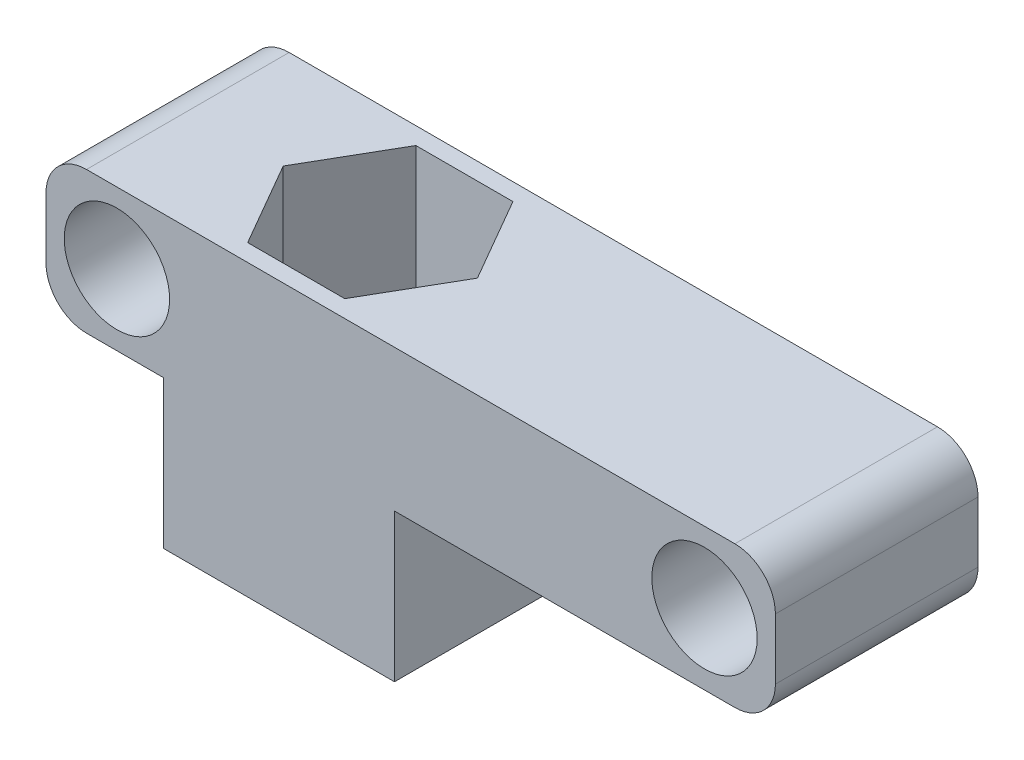
ISO-10303-21;
HEADER;
FILE_DESCRIPTION(('STEP AP214'),'2;1');
FILE_NAME('part.step','',(''),(''),'','','');
FILE_SCHEMA(('AUTOMOTIVE_DESIGN { 1 0 10303 214 1 1 1 1 }'));
ENDSEC;
DATA;
#1=APPLICATION_CONTEXT('core data for automotive mechanical design processes');
#2=APPLICATION_PROTOCOL_DEFINITION('international standard','automotive_design',2000,#1);
#3=PRODUCT_CONTEXT('',#1,'mechanical');
#4=PRODUCT('Part','Part','',(#3));
#5=PRODUCT_RELATED_PRODUCT_CATEGORY('part','',(#4));
#6=PRODUCT_DEFINITION_FORMATION('','',#4);
#7=PRODUCT_DEFINITION_CONTEXT('part definition',#1,'design');
#8=PRODUCT_DEFINITION('design','',#6,#7);
#9=PRODUCT_DEFINITION_SHAPE('','',#8);
#10=(LENGTH_UNIT() NAMED_UNIT(*) SI_UNIT(.MILLI.,.METRE.));
#11=(NAMED_UNIT(*) PLANE_ANGLE_UNIT() SI_UNIT($,.RADIAN.));
#12=(NAMED_UNIT(*) SI_UNIT($,.STERADIAN.) SOLID_ANGLE_UNIT());
#13=UNCERTAINTY_MEASURE_WITH_UNIT(LENGTH_MEASURE(1.E-05),#10,'distance_accuracy_value','');
#14=(GEOMETRIC_REPRESENTATION_CONTEXT(3) GLOBAL_UNCERTAINTY_ASSIGNED_CONTEXT((#13)) GLOBAL_UNIT_ASSIGNED_CONTEXT((#10,
#11,#12)) REPRESENTATION_CONTEXT('',''));
#15=CARTESIAN_POINT('',(0.,0.,0.));
#16=DIRECTION('',(0.,0.,1.));
#17=DIRECTION('',(1.,0.,0.));
#18=AXIS2_PLACEMENT_3D('',#15,#16,#17);
#19=CARTESIAN_POINT('',(-46.016694490818,8.8780487804878,10.));
#20=DIRECTION('',(0.,1.,0.));
#21=DIRECTION('',(0.,0.,1.));
#22=AXIS2_PLACEMENT_3D('',#19,#20,#21);
#23=PLANE('',#22);
#24=DIRECTION('',(1.,0.,0.));
#25=VECTOR('',#24,1.);
#26=CARTESIAN_POINT('',(-46.016694490818,8.8780487804878,10.));
#27=LINE('',#26,#25);
#28=CARTESIAN_POINT('',(-44.016694490818,8.8780487804878,10.));
#29=VERTEX_POINT('',#28);
#30=CARTESIAN_POINT('',(-40.216694490818,8.8780487804878,10.));
#31=VERTEX_POINT('',#30);
#32=EDGE_CURVE('E325',#29,#31,#27,.T.);
#33=ORIENTED_EDGE('',*,*,#32,.F.);
#34=DIRECTION('',(0.,0.,-1.));
#35=VECTOR('',#34,1.);
#36=CARTESIAN_POINT('',(-44.016694490818,8.8780487804878,10.));
#37=LINE('',#36,#35);
#38=CARTESIAN_POINT('',(-44.016694490818,8.8780487804878,0.));
#39=VERTEX_POINT('',#38);
#40=EDGE_CURVE('E347',#29,#39,#37,.T.);
#41=ORIENTED_EDGE('',*,*,#40,.T.);
#42=DIRECTION('',(1.,0.,0.));
#43=VECTOR('',#42,1.);
#44=CARTESIAN_POINT('',(-46.016694490818,8.8780487804878,0.));
#45=LINE('',#44,#43);
#46=CARTESIAN_POINT('',(-40.216694490818,8.8780487804878,0.));
#47=VERTEX_POINT('',#46);
#48=EDGE_CURVE('E306',#39,#47,#45,.T.);
#49=ORIENTED_EDGE('',*,*,#48,.T.);
#50=DIRECTION('',(0.,0.,-1.));
#51=VECTOR('',#50,1.);
#52=CARTESIAN_POINT('',(-40.216694490818,8.8780487804878,10.));
#53=LINE('',#52,#51);
#54=EDGE_CURVE('E203',#31,#47,#53,.T.);
#55=ORIENTED_EDGE('',*,*,#54,.F.);
#56=EDGE_LOOP('',(#33,#41,#49,#55));
#57=FACE_BOUND('',#56,.T.);
#58=ADVANCED_FACE('F33',(#57),#23,.F.);
#59=CARTESIAN_POINT('',(-28.816694490818,8.8780487804878,0.));
#60=VERTEX_POINT('',#59);
#61=CARTESIAN_POINT('',(-12.016694490818,8.8780487804878,0.));
#62=VERTEX_POINT('',#61);
#63=EDGE_CURVE('E310',#60,#62,#45,.T.);
#64=ORIENTED_EDGE('',*,*,#63,.T.);
#65=DIRECTION('',(0.,0.,-1.));
#66=VECTOR('',#65,1.);
#67=CARTESIAN_POINT('',(-12.016694490818,8.8780487804878,10.));
#68=LINE('',#67,#66);
#69=CARTESIAN_POINT('',(-12.016694490818,8.8780487804878,10.));
#70=VERTEX_POINT('',#69);
#71=EDGE_CURVE('E48',#62,#70,#68,.F.);
#72=ORIENTED_EDGE('',*,*,#71,.T.);
#73=CARTESIAN_POINT('',(-28.816694490818,8.8780487804878,10.));
#74=VERTEX_POINT('',#73);
#75=EDGE_CURVE('E322',#74,#70,#27,.T.);
#76=ORIENTED_EDGE('',*,*,#75,.F.);
#77=DIRECTION('',(0.,0.,1.));
#78=VECTOR('',#77,1.);
#79=CARTESIAN_POINT('',(-28.816694490818,8.8780487804878,10.));
#80=LINE('',#79,#78);
#81=EDGE_CURVE('E292',#60,#74,#80,.T.);
#82=ORIENTED_EDGE('',*,*,#81,.F.);
#83=EDGE_LOOP('',(#64,#72,#76,#82));
#84=FACE_BOUND('',#83,.T.);
#85=ADVANCED_FACE('F487',(#84),#23,.F.);
#86=CARTESIAN_POINT('',(0.,0.,10.));
#87=DIRECTION('',(0.,0.,1.));
#88=DIRECTION('',(1.,0.,0.));
#89=AXIS2_PLACEMENT_3D('',#86,#87,#88);
#90=PLANE('',#89);
#91=CARTESIAN_POINT('',(-42.516694490818,12.3780487804878,10.));
#92=DIRECTION('',(0.,0.,1.));
#93=DIRECTION('',(1.,0.,0.));
#94=AXIS2_PLACEMENT_3D('',#91,#92,#93);
#95=CIRCLE('',#94,2.6);
#96=CARTESIAN_POINT('',(-39.916694490818,12.3780487804878,10.));
#97=VERTEX_POINT('',#96);
#98=EDGE_CURVE('E361',#97,#97,#95,.T.);
#99=ORIENTED_EDGE('',*,*,#98,.F.);
#100=EDGE_LOOP('',(#99));
#101=FACE_BOUND('',#100,.T.);
#102=DIRECTION('',(0.,1.,0.));
#103=VECTOR('',#102,1.);
#104=CARTESIAN_POINT('',(-10.016694490818,15.8780487804878,10.));
#105=LINE('',#104,#103);
#106=CARTESIAN_POINT('',(-10.016694490818,10.8780487804878,10.));
#107=VERTEX_POINT('',#106);
#108=CARTESIAN_POINT('',(-10.016694490818,13.8780487804878,10.));
#109=VERTEX_POINT('',#108);
#110=EDGE_CURVE('E332',#107,#109,#105,.T.);
#111=ORIENTED_EDGE('',*,*,#110,.T.);
#112=CARTESIAN_POINT('',(-12.016694490818,13.8780487804878,10.));
#113=DIRECTION('',(0.,0.,1.));
#114=DIRECTION('',(1.,0.,0.));
#115=AXIS2_PLACEMENT_3D('',#112,#113,#114);
#116=CIRCLE('',#115,2.);
#117=CARTESIAN_POINT('',(-12.016694490818,15.8780487804878,10.));
#118=VERTEX_POINT('',#117);
#119=EDGE_CURVE('E344',#109,#118,#116,.T.);
#120=ORIENTED_EDGE('',*,*,#119,.T.);
#121=DIRECTION('',(-1.,0.,0.));
#122=VECTOR('',#121,1.);
#123=CARTESIAN_POINT('',(-46.016694490818,15.8780487804878,10.));
#124=LINE('',#123,#122);
#125=CARTESIAN_POINT('',(-44.016694490818,15.8780487804878,10.));
#126=VERTEX_POINT('',#125);
#127=EDGE_CURVE('E302',#118,#126,#124,.T.);
#128=ORIENTED_EDGE('',*,*,#127,.T.);
#129=CARTESIAN_POINT('',(-44.016694490818,13.8780487804878,10.));
#130=DIRECTION('',(0.,0.,1.));
#131=DIRECTION('',(1.,0.,0.));
#132=AXIS2_PLACEMENT_3D('',#129,#130,#131);
#133=CIRCLE('',#132,2.);
#134=CARTESIAN_POINT('',(-46.016694490818,13.8780487804878,10.));
#135=VERTEX_POINT('',#134);
#136=EDGE_CURVE('E339',#126,#135,#133,.T.);
#137=ORIENTED_EDGE('',*,*,#136,.T.);
#138=DIRECTION('',(0.,-1.,0.));
#139=VECTOR('',#138,1.);
#140=CARTESIAN_POINT('',(-46.016694490818,15.8780487804878,10.));
#141=LINE('',#140,#139);
#142=CARTESIAN_POINT('',(-46.016694490818,10.8780487804878,10.));
#143=VERTEX_POINT('',#142);
#144=EDGE_CURVE('E326',#135,#143,#141,.T.);
#145=ORIENTED_EDGE('',*,*,#144,.T.);
#146=CARTESIAN_POINT('',(-44.016694490818,10.8780487804878,10.));
#147=DIRECTION('',(0.,0.,1.));
#148=DIRECTION('',(1.,0.,0.));
#149=AXIS2_PLACEMENT_3D('',#146,#147,#148);
#150=CIRCLE('',#149,2.);
#151=EDGE_CURVE('E56',#143,#29,#150,.T.);
#152=ORIENTED_EDGE('',*,*,#151,.T.);
#153=ORIENTED_EDGE('',*,*,#32,.T.);
#154=DIRECTION('',(0.,1.,0.));
#155=VECTOR('',#154,1.);
#156=CARTESIAN_POINT('',(-40.216694490818,3.8780487804878,10.));
#157=LINE('',#156,#155);
#158=CARTESIAN_POINT('',(-40.216694490818,1.5780487804878,10.));
#159=VERTEX_POINT('',#158);
#160=EDGE_CURVE('E294',#159,#31,#157,.T.);
#161=ORIENTED_EDGE('',*,*,#160,.F.);
#162=DIRECTION('',(-1.,0.,0.));
#163=VECTOR('',#162,1.);
#164=CARTESIAN_POINT('',(-40.216694490818,1.5780487804878,10.));
#165=LINE('',#164,#163);
#166=CARTESIAN_POINT('',(-28.816694490818,1.5780487804878,10.));
#167=VERTEX_POINT('',#166);
#168=EDGE_CURVE('E225',#167,#159,#165,.T.);
#169=ORIENTED_EDGE('',*,*,#168,.F.);
#170=DIRECTION('',(0.,1.,0.));
#171=VECTOR('',#170,1.);
#172=CARTESIAN_POINT('',(-28.816694490818,3.8780487804878,10.));
#173=LINE('',#172,#171);
#174=EDGE_CURVE('E296',#167,#74,#173,.T.);
#175=ORIENTED_EDGE('',*,*,#174,.T.);
#176=ORIENTED_EDGE('',*,*,#75,.T.);
#177=CARTESIAN_POINT('',(-12.016694490818,10.8780487804878,10.));
#178=DIRECTION('',(0.,0.,1.));
#179=DIRECTION('',(1.,0.,0.));
#180=AXIS2_PLACEMENT_3D('',#177,#178,#179);
#181=CIRCLE('',#180,2.);
#182=EDGE_CURVE('E342',#70,#107,#181,.T.);
#183=ORIENTED_EDGE('',*,*,#182,.T.);
#184=EDGE_LOOP('',(#111,#120,#128,#137,#145,#152,#153,#161,#169,#175,#176,#183));
#185=FACE_BOUND('',#184,.T.);
#186=CARTESIAN_POINT('',(-13.516694490818,12.3780487804878,10.));
#187=DIRECTION('',(0.,0.,1.));
#188=DIRECTION('',(1.,0.,0.));
#189=AXIS2_PLACEMENT_3D('',#186,#187,#188);
#190=CIRCLE('',#189,2.6);
#191=CARTESIAN_POINT('',(-10.916694490818,12.3780487804878,10.));
#192=VERTEX_POINT('',#191);
#193=EDGE_CURVE('E368',#192,#192,#190,.T.);
#194=ORIENTED_EDGE('',*,*,#193,.F.);
#195=EDGE_LOOP('',(#194));
#196=FACE_BOUND('',#195,.T.);
#197=ADVANCED_FACE('F493',(#101,#185,#196),#90,.T.);
#198=CARTESIAN_POINT('',(0.,0.,0.));
#199=DIRECTION('',(0.,0.,1.));
#200=DIRECTION('',(1.,0.,0.));
#201=AXIS2_PLACEMENT_3D('',#198,#199,#200);
#202=PLANE('',#201);
#203=DIRECTION('',(-1.,0.,0.));
#204=VECTOR('',#203,1.);
#205=CARTESIAN_POINT('',(-46.016694490818,15.8780487804878,0.));
#206=LINE('',#205,#204);
#207=CARTESIAN_POINT('',(-12.016694490818,15.8780487804878,0.));
#208=VERTEX_POINT('',#207);
#209=CARTESIAN_POINT('',(-44.016694490818,15.8780487804878,0.));
#210=VERTEX_POINT('',#209);
#211=EDGE_CURVE('E321',#208,#210,#206,.T.);
#212=ORIENTED_EDGE('',*,*,#211,.F.);
#213=CARTESIAN_POINT('',(-12.016694490818,13.8780487804878,0.));
#214=DIRECTION('',(0.,0.,1.));
#215=DIRECTION('',(1.,0.,0.));
#216=AXIS2_PLACEMENT_3D('',#213,#214,#215);
#217=CIRCLE('',#216,2.);
#218=CARTESIAN_POINT('',(-10.016694490818,13.8780487804878,0.));
#219=VERTEX_POINT('',#218);
#220=EDGE_CURVE('E530',#208,#219,#217,.F.);
#221=ORIENTED_EDGE('',*,*,#220,.T.);
#222=DIRECTION('',(0.,1.,0.));
#223=VECTOR('',#222,1.);
#224=CARTESIAN_POINT('',(-10.016694490818,15.8780487804878,0.));
#225=LINE('',#224,#223);
#226=CARTESIAN_POINT('',(-10.016694490818,10.8780487804878,0.));
#227=VERTEX_POINT('',#226);
#228=EDGE_CURVE('E309',#227,#219,#225,.T.);
#229=ORIENTED_EDGE('',*,*,#228,.F.);
#230=CARTESIAN_POINT('',(-12.016694490818,10.8780487804878,0.));
#231=DIRECTION('',(0.,0.,1.));
#232=DIRECTION('',(1.,0.,0.));
#233=AXIS2_PLACEMENT_3D('',#230,#231,#232);
#234=CIRCLE('',#233,2.);
#235=EDGE_CURVE('E526',#227,#62,#234,.F.);
#236=ORIENTED_EDGE('',*,*,#235,.T.);
#237=ORIENTED_EDGE('',*,*,#63,.F.);
#238=DIRECTION('',(0.,1.,0.));
#239=VECTOR('',#238,1.);
#240=CARTESIAN_POINT('',(-28.816694490818,3.8780487804878,0.));
#241=LINE('',#240,#239);
#242=CARTESIAN_POINT('',(-28.816694490818,1.5780487804878,0.));
#243=VERTEX_POINT('',#242);
#244=EDGE_CURVE('E207',#243,#60,#241,.T.);
#245=ORIENTED_EDGE('',*,*,#244,.F.);
#246=DIRECTION('',(1.,0.,0.));
#247=VECTOR('',#246,1.);
#248=CARTESIAN_POINT('',(-40.216694490818,1.5780487804878,0.));
#249=LINE('',#248,#247);
#250=CARTESIAN_POINT('',(-40.216694490818,1.5780487804878,0.));
#251=VERTEX_POINT('',#250);
#252=EDGE_CURVE('E210',#251,#243,#249,.T.);
#253=ORIENTED_EDGE('',*,*,#252,.F.);
#254=DIRECTION('',(0.,1.,0.));
#255=VECTOR('',#254,1.);
#256=CARTESIAN_POINT('',(-40.216694490818,3.8780487804878,0.));
#257=LINE('',#256,#255);
#258=EDGE_CURVE('E196',#251,#47,#257,.T.);
#259=ORIENTED_EDGE('',*,*,#258,.T.);
#260=ORIENTED_EDGE('',*,*,#48,.F.);
#261=CARTESIAN_POINT('',(-44.016694490818,10.8780487804878,0.));
#262=DIRECTION('',(0.,0.,1.));
#263=DIRECTION('',(1.,0.,0.));
#264=AXIS2_PLACEMENT_3D('',#261,#262,#263);
#265=CIRCLE('',#264,2.);
#266=CARTESIAN_POINT('',(-46.016694490818,10.8780487804878,0.));
#267=VERTEX_POINT('',#266);
#268=EDGE_CURVE('E360',#39,#267,#265,.F.);
#269=ORIENTED_EDGE('',*,*,#268,.T.);
#270=DIRECTION('',(0.,-1.,0.));
#271=VECTOR('',#270,1.);
#272=CARTESIAN_POINT('',(-46.016694490818,15.8780487804878,0.));
#273=LINE('',#272,#271);
#274=CARTESIAN_POINT('',(-46.016694490818,13.8780487804878,0.));
#275=VERTEX_POINT('',#274);
#276=EDGE_CURVE('E315',#275,#267,#273,.T.);
#277=ORIENTED_EDGE('',*,*,#276,.F.);
#278=CARTESIAN_POINT('',(-44.016694490818,13.8780487804878,0.));
#279=DIRECTION('',(0.,0.,1.));
#280=DIRECTION('',(1.,0.,0.));
#281=AXIS2_PLACEMENT_3D('',#278,#279,#280);
#282=CIRCLE('',#281,2.);
#283=EDGE_CURVE('E305',#275,#210,#282,.F.);
#284=ORIENTED_EDGE('',*,*,#283,.T.);
#285=EDGE_LOOP('',(#212,#221,#229,#236,#237,#245,#253,#259,#260,#269,#277,#284));
#286=FACE_BOUND('',#285,.T.);
#287=CARTESIAN_POINT('',(-42.516694490818,12.3780487804878,0.));
#288=DIRECTION('',(0.,0.,1.));
#289=DIRECTION('',(1.,0.,0.));
#290=AXIS2_PLACEMENT_3D('',#287,#288,#289);
#291=CIRCLE('',#290,2.6);
#292=CARTESIAN_POINT('',(-39.916694490818,12.3780487804878,0.));
#293=VERTEX_POINT('',#292);
#294=EDGE_CURVE('E363',#293,#293,#291,.T.);
#295=ORIENTED_EDGE('',*,*,#294,.T.);
#296=EDGE_LOOP('',(#295));
#297=FACE_BOUND('',#296,.T.);
#298=CARTESIAN_POINT('',(-13.516694490818,12.3780487804878,0.));
#299=DIRECTION('',(0.,0.,1.));
#300=DIRECTION('',(1.,0.,0.));
#301=AXIS2_PLACEMENT_3D('',#298,#299,#300);
#302=CIRCLE('',#301,2.6);
#303=CARTESIAN_POINT('',(-10.916694490818,12.3780487804878,0.));
#304=VERTEX_POINT('',#303);
#305=EDGE_CURVE('E370',#304,#304,#302,.T.);
#306=ORIENTED_EDGE('',*,*,#305,.T.);
#307=EDGE_LOOP('',(#306));
#308=FACE_BOUND('',#307,.T.);
#309=ADVANCED_FACE('F212',(#286,#297,#308),#202,.F.);
#310=CARTESIAN_POINT('',(-46.016694490818,15.8780487804878,10.));
#311=DIRECTION('',(1.,0.,0.));
#312=DIRECTION('',(0.,0.,-1.));
#313=AXIS2_PLACEMENT_3D('',#310,#311,#312);
#314=PLANE('',#313);
#315=ORIENTED_EDGE('',*,*,#276,.T.);
#316=DIRECTION('',(0.,0.,-1.));
#317=VECTOR('',#316,1.);
#318=CARTESIAN_POINT('',(-46.016694490818,10.8780487804878,10.));
#319=LINE('',#318,#317);
#320=EDGE_CURVE('E11',#267,#143,#319,.F.);
#321=ORIENTED_EDGE('',*,*,#320,.T.);
#322=ORIENTED_EDGE('',*,*,#144,.F.);
#323=DIRECTION('',(0.,0.,-1.));
#324=VECTOR('',#323,1.);
#325=CARTESIAN_POINT('',(-46.016694490818,13.8780487804878,10.));
#326=LINE('',#325,#324);
#327=EDGE_CURVE('E41',#135,#275,#326,.T.);
#328=ORIENTED_EDGE('',*,*,#327,.T.);
#329=EDGE_LOOP('',(#315,#321,#322,#328));
#330=FACE_BOUND('',#329,.T.);
#331=ADVANCED_FACE('F355',(#330),#314,.F.);
#332=CARTESIAN_POINT('',(-10.016694490818,15.8780487804878,10.));
#333=DIRECTION('',(-1.,0.,0.));
#334=DIRECTION('',(0.,-1.,0.));
#335=AXIS2_PLACEMENT_3D('',#332,#333,#334);
#336=PLANE('',#335);
#337=ORIENTED_EDGE('',*,*,#228,.T.);
#338=DIRECTION('',(0.,0.,-1.));
#339=VECTOR('',#338,1.);
#340=CARTESIAN_POINT('',(-10.016694490818,13.8780487804878,10.));
#341=LINE('',#340,#339);
#342=EDGE_CURVE('E337',#219,#109,#341,.F.);
#343=ORIENTED_EDGE('',*,*,#342,.T.);
#344=ORIENTED_EDGE('',*,*,#110,.F.);
#345=DIRECTION('',(0.,0.,-1.));
#346=VECTOR('',#345,1.);
#347=CARTESIAN_POINT('',(-10.016694490818,10.8780487804878,10.));
#348=LINE('',#347,#346);
#349=EDGE_CURVE('E532',#107,#227,#348,.T.);
#350=ORIENTED_EDGE('',*,*,#349,.T.);
#351=EDGE_LOOP('',(#337,#343,#344,#350));
#352=FACE_BOUND('',#351,.T.);
#353=ADVANCED_FACE('F496',(#352),#336,.F.);
#354=CARTESIAN_POINT('',(-46.016694490818,15.8780487804878,10.));
#355=DIRECTION('',(0.,-1.,0.));
#356=DIRECTION('',(0.,0.,-1.));
#357=AXIS2_PLACEMENT_3D('',#354,#355,#356);
#358=PLANE('',#357);
#359=DIRECTION('',(1.,0.,0.));
#360=VECTOR('',#359,1.);
#361=CARTESIAN_POINT('',(-36.912698107955,15.8780487804878,0.849999999999997));
#362=LINE('',#361,#360);
#363=CARTESIAN_POINT('',(-36.912698107955,15.8780487804878,0.849999999999997));
#364=VERTEX_POINT('',#363);
#365=CARTESIAN_POINT('',(-32.1206908736811,15.8780487804878,0.849999999999996));
#366=VERTEX_POINT('',#365);
#367=EDGE_CURVE('E380',#364,#366,#362,.T.);
#368=ORIENTED_EDGE('',*,*,#367,.T.);
#369=DIRECTION('',(0.5,0.,0.866025403784439));
#370=VECTOR('',#369,1.);
#371=CARTESIAN_POINT('',(-32.1206908736811,15.8780487804878,0.849999999999996));
#372=LINE('',#371,#370);
#373=CARTESIAN_POINT('',(-29.7246872565441,15.8780487804878,5.00000000000001));
#374=VERTEX_POINT('',#373);
#375=EDGE_CURVE('E397',#366,#374,#372,.T.);
#376=ORIENTED_EDGE('',*,*,#375,.T.);
#377=DIRECTION('',(-0.5,0.,0.866025403784439));
#378=VECTOR('',#377,1.);
#379=CARTESIAN_POINT('',(-29.7246872565441,15.8780487804878,5.00000000000001));
#380=LINE('',#379,#378);
#381=CARTESIAN_POINT('',(-32.1206908736811,15.8780487804878,9.15));
#382=VERTEX_POINT('',#381);
#383=EDGE_CURVE('E423',#374,#382,#380,.T.);
#384=ORIENTED_EDGE('',*,*,#383,.T.);
#385=DIRECTION('',(-1.,0.,0.));
#386=VECTOR('',#385,1.);
#387=CARTESIAN_POINT('',(-32.1206908736811,15.8780487804878,9.15));
#388=LINE('',#387,#386);
#389=CARTESIAN_POINT('',(-36.912698107955,15.8780487804878,9.15));
#390=VERTEX_POINT('',#389);
#391=EDGE_CURVE('E420',#382,#390,#388,.T.);
#392=ORIENTED_EDGE('',*,*,#391,.T.);
#393=DIRECTION('',(-0.5,0.,-0.866025403784439));
#394=VECTOR('',#393,1.);
#395=CARTESIAN_POINT('',(-36.912698107955,15.8780487804878,9.15));
#396=LINE('',#395,#394);
#397=CARTESIAN_POINT('',(-39.3087017250919,15.8780487804878,4.99999999999999));
#398=VERTEX_POINT('',#397);
#399=EDGE_CURVE('E417',#390,#398,#396,.T.);
#400=ORIENTED_EDGE('',*,*,#399,.T.);
#401=DIRECTION('',(0.5,0.,-0.866025403784438));
#402=VECTOR('',#401,1.);
#403=CARTESIAN_POINT('',(-39.3087017250919,15.8780487804878,4.99999999999999));
#404=LINE('',#403,#402);
#405=EDGE_CURVE('E414',#398,#364,#404,.T.);
#406=ORIENTED_EDGE('',*,*,#405,.T.);
#407=EDGE_LOOP('',(#368,#376,#384,#392,#400,#406));
#408=FACE_BOUND('',#407,.T.);
#409=ORIENTED_EDGE('',*,*,#127,.F.);
#410=DIRECTION('',(0.,0.,-1.));
#411=VECTOR('',#410,1.);
#412=CARTESIAN_POINT('',(-12.016694490818,15.8780487804878,10.));
#413=LINE('',#412,#411);
#414=EDGE_CURVE('E301',#118,#208,#413,.T.);
#415=ORIENTED_EDGE('',*,*,#414,.T.);
#416=ORIENTED_EDGE('',*,*,#211,.T.);
#417=DIRECTION('',(0.,0.,-1.));
#418=VECTOR('',#417,1.);
#419=CARTESIAN_POINT('',(-44.016694490818,15.8780487804878,10.));
#420=LINE('',#419,#418);
#421=EDGE_CURVE('E299',#210,#126,#420,.F.);
#422=ORIENTED_EDGE('',*,*,#421,.T.);
#423=EDGE_LOOP('',(#409,#415,#416,#422));
#424=FACE_BOUND('',#423,.T.);
#425=ADVANCED_FACE('F428',(#408,#424),#358,.F.);
#426=CARTESIAN_POINT('',(-42.516694490818,12.3780487804878,10.));
#427=DIRECTION('',(0.,0.,-1.));
#428=DIRECTION('',(-1.,0.,0.));
#429=AXIS2_PLACEMENT_3D('',#426,#427,#428);
#430=CYLINDRICAL_SURFACE('',#429,2.6);
#431=ORIENTED_EDGE('',*,*,#98,.T.);
#432=EDGE_LOOP('',(#431));
#433=FACE_BOUND('',#432,.T.);
#434=ORIENTED_EDGE('',*,*,#294,.F.);
#435=EDGE_LOOP('',(#434));
#436=FACE_BOUND('',#435,.T.);
#437=ADVANCED_FACE('F543',(#433,#436),#430,.F.);
#438=CARTESIAN_POINT('',(-13.516694490818,12.3780487804878,10.));
#439=DIRECTION('',(0.,0.,-1.));
#440=DIRECTION('',(-1.,0.,0.));
#441=AXIS2_PLACEMENT_3D('',#438,#439,#440);
#442=CYLINDRICAL_SURFACE('',#441,2.6);
#443=ORIENTED_EDGE('',*,*,#193,.T.);
#444=EDGE_LOOP('',(#443));
#445=FACE_BOUND('',#444,.T.);
#446=ORIENTED_EDGE('',*,*,#305,.F.);
#447=EDGE_LOOP('',(#446));
#448=FACE_BOUND('',#447,.T.);
#449=ADVANCED_FACE('F548',(#445,#448),#442,.F.);
#450=CARTESIAN_POINT('',(-32.1206908736811,15.8780487804878,0.849999999999996));
#451=DIRECTION('',(0.866025403784439,0.,-0.5));
#452=DIRECTION('',(-0.5,0.,-0.866025403784439));
#453=AXIS2_PLACEMENT_3D('',#450,#451,#452);
#454=PLANE('',#453);
#455=DIRECTION('',(0.5,0.,0.866025403784439));
#456=VECTOR('',#455,1.);
#457=CARTESIAN_POINT('',(-32.1206908736811,8.8780487804878,0.849999999999996));
#458=LINE('',#457,#456);
#459=CARTESIAN_POINT('',(-32.1206908736811,8.8780487804878,0.849999999999996));
#460=VERTEX_POINT('',#459);
#461=CARTESIAN_POINT('',(-29.7246872565441,8.8780487804878,5.00000000000001));
#462=VERTEX_POINT('',#461);
#463=EDGE_CURVE('E206',#460,#462,#458,.T.);
#464=ORIENTED_EDGE('',*,*,#463,.T.);
#465=DIRECTION('',(0.,-1.,0.));
#466=VECTOR('',#465,1.);
#467=CARTESIAN_POINT('',(-29.7246872565441,15.8780487804878,5.00000000000001));
#468=LINE('',#467,#466);
#469=EDGE_CURVE('E376',#374,#462,#468,.T.);
#470=ORIENTED_EDGE('',*,*,#469,.F.);
#471=ORIENTED_EDGE('',*,*,#375,.F.);
#472=DIRECTION('',(0.,-1.,0.));
#473=VECTOR('',#472,1.);
#474=CARTESIAN_POINT('',(-32.1206908736811,15.8780487804878,0.849999999999996));
#475=LINE('',#474,#473);
#476=EDGE_CURVE('E373',#366,#460,#475,.T.);
#477=ORIENTED_EDGE('',*,*,#476,.T.);
#478=EDGE_LOOP('',(#464,#470,#471,#477));
#479=FACE_BOUND('',#478,.T.);
#480=ADVANCED_FACE('F433',(#479),#454,.F.);
#481=CARTESIAN_POINT('',(-36.912698107955,15.8780487804878,0.849999999999997));
#482=DIRECTION('',(0.,0.,-1.));
#483=DIRECTION('',(-1.,0.,0.));
#484=AXIS2_PLACEMENT_3D('',#481,#482,#483);
#485=PLANE('',#484);
#486=DIRECTION('',(1.,0.,0.));
#487=VECTOR('',#486,1.);
#488=CARTESIAN_POINT('',(-36.912698107955,8.8780487804878,0.849999999999997));
#489=LINE('',#488,#487);
#490=CARTESIAN_POINT('',(-36.912698107955,8.8780487804878,0.849999999999997));
#491=VERTEX_POINT('',#490);
#492=EDGE_CURVE('E394',#491,#460,#489,.T.);
#493=ORIENTED_EDGE('',*,*,#492,.T.);
#494=ORIENTED_EDGE('',*,*,#476,.F.);
#495=ORIENTED_EDGE('',*,*,#367,.F.);
#496=DIRECTION('',(0.,-1.,0.));
#497=VECTOR('',#496,1.);
#498=CARTESIAN_POINT('',(-36.912698107955,15.8780487804878,0.849999999999997));
#499=LINE('',#498,#497);
#500=EDGE_CURVE('E389',#364,#491,#499,.T.);
#501=ORIENTED_EDGE('',*,*,#500,.T.);
#502=EDGE_LOOP('',(#493,#494,#495,#501));
#503=FACE_BOUND('',#502,.T.);
#504=ADVANCED_FACE('F446',(#503),#485,.F.);
#505=CARTESIAN_POINT('',(-39.3087017250919,15.8780487804878,4.99999999999999));
#506=DIRECTION('',(-0.866025403784438,0.,-0.5));
#507=DIRECTION('',(-0.5,0.,0.866025403784439));
#508=AXIS2_PLACEMENT_3D('',#505,#506,#507);
#509=PLANE('',#508);
#510=DIRECTION('',(0.5,0.,-0.866025403784438));
#511=VECTOR('',#510,1.);
#512=CARTESIAN_POINT('',(-39.3087017250919,8.8780487804878,4.99999999999999));
#513=LINE('',#512,#511);
#514=CARTESIAN_POINT('',(-39.3087017250919,8.8780487804878,4.99999999999999));
#515=VERTEX_POINT('',#514);
#516=EDGE_CURVE('E398',#515,#491,#513,.T.);
#517=ORIENTED_EDGE('',*,*,#516,.T.);
#518=ORIENTED_EDGE('',*,*,#500,.F.);
#519=ORIENTED_EDGE('',*,*,#405,.F.);
#520=DIRECTION('',(0.,-1.,0.));
#521=VECTOR('',#520,1.);
#522=CARTESIAN_POINT('',(-39.3087017250919,15.8780487804878,4.99999999999999));
#523=LINE('',#522,#521);
#524=EDGE_CURVE('E386',#398,#515,#523,.T.);
#525=ORIENTED_EDGE('',*,*,#524,.T.);
#526=EDGE_LOOP('',(#517,#518,#519,#525));
#527=FACE_BOUND('',#526,.T.);
#528=ADVANCED_FACE('F444',(#527),#509,.F.);
#529=CARTESIAN_POINT('',(-36.912698107955,15.8780487804878,9.15));
#530=DIRECTION('',(-0.866025403784439,0.,0.5));
#531=DIRECTION('',(0.5,0.,0.866025403784439));
#532=AXIS2_PLACEMENT_3D('',#529,#530,#531);
#533=PLANE('',#532);
#534=DIRECTION('',(-0.5,0.,-0.866025403784439));
#535=VECTOR('',#534,1.);
#536=CARTESIAN_POINT('',(-36.912698107955,8.8780487804878,9.15));
#537=LINE('',#536,#535);
#538=CARTESIAN_POINT('',(-36.912698107955,8.8780487804878,9.15));
#539=VERTEX_POINT('',#538);
#540=EDGE_CURVE('E401',#539,#515,#537,.T.);
#541=ORIENTED_EDGE('',*,*,#540,.T.);
#542=ORIENTED_EDGE('',*,*,#524,.F.);
#543=ORIENTED_EDGE('',*,*,#399,.F.);
#544=DIRECTION('',(0.,-1.,0.));
#545=VECTOR('',#544,1.);
#546=CARTESIAN_POINT('',(-36.912698107955,15.8780487804878,9.15));
#547=LINE('',#546,#545);
#548=EDGE_CURVE('E383',#390,#539,#547,.T.);
#549=ORIENTED_EDGE('',*,*,#548,.T.);
#550=EDGE_LOOP('',(#541,#542,#543,#549));
#551=FACE_BOUND('',#550,.T.);
#552=ADVANCED_FACE('F442',(#551),#533,.F.);
#553=CARTESIAN_POINT('',(-32.1206908736811,15.8780487804878,9.15));
#554=DIRECTION('',(0.,0.,1.));
#555=DIRECTION('',(1.,0.,0.));
#556=AXIS2_PLACEMENT_3D('',#553,#554,#555);
#557=PLANE('',#556);
#558=DIRECTION('',(-1.,0.,0.));
#559=VECTOR('',#558,1.);
#560=CARTESIAN_POINT('',(-32.1206908736811,8.8780487804878,9.15));
#561=LINE('',#560,#559);
#562=CARTESIAN_POINT('',(-32.1206908736811,8.8780487804878,9.15));
#563=VERTEX_POINT('',#562);
#564=EDGE_CURVE('E404',#563,#539,#561,.T.);
#565=ORIENTED_EDGE('',*,*,#564,.T.);
#566=ORIENTED_EDGE('',*,*,#548,.F.);
#567=ORIENTED_EDGE('',*,*,#391,.F.);
#568=DIRECTION('',(0.,-1.,0.));
#569=VECTOR('',#568,1.);
#570=CARTESIAN_POINT('',(-32.1206908736811,15.8780487804878,9.15));
#571=LINE('',#570,#569);
#572=EDGE_CURVE('E379',#382,#563,#571,.T.);
#573=ORIENTED_EDGE('',*,*,#572,.T.);
#574=EDGE_LOOP('',(#565,#566,#567,#573));
#575=FACE_BOUND('',#574,.T.);
#576=ADVANCED_FACE('F438',(#575),#557,.F.);
#577=CARTESIAN_POINT('',(-29.7246872565441,15.8780487804878,5.00000000000001));
#578=DIRECTION('',(0.866025403784439,0.,0.5));
#579=DIRECTION('',(0.5,0.,-0.866025403784439));
#580=AXIS2_PLACEMENT_3D('',#577,#578,#579);
#581=PLANE('',#580);
#582=DIRECTION('',(-0.5,0.,0.866025403784439));
#583=VECTOR('',#582,1.);
#584=CARTESIAN_POINT('',(-29.7246872565441,8.8780487804878,5.00000000000001));
#585=LINE('',#584,#583);
#586=EDGE_CURVE('E407',#462,#563,#585,.T.);
#587=ORIENTED_EDGE('',*,*,#586,.T.);
#588=ORIENTED_EDGE('',*,*,#572,.F.);
#589=ORIENTED_EDGE('',*,*,#383,.F.);
#590=ORIENTED_EDGE('',*,*,#469,.T.);
#591=EDGE_LOOP('',(#587,#588,#589,#590));
#592=FACE_BOUND('',#591,.T.);
#593=ADVANCED_FACE('F436',(#592),#581,.F.);
#594=CARTESIAN_POINT('',(0.,8.8780487804878,0.));
#595=DIRECTION('',(0.,-1.,0.));
#596=DIRECTION('',(0.,0.,-1.));
#597=AXIS2_PLACEMENT_3D('',#594,#595,#596);
#598=PLANE('',#597);
#599=ORIENTED_EDGE('',*,*,#586,.F.);
#600=ORIENTED_EDGE('',*,*,#463,.F.);
#601=ORIENTED_EDGE('',*,*,#492,.F.);
#602=ORIENTED_EDGE('',*,*,#516,.F.);
#603=ORIENTED_EDGE('',*,*,#540,.F.);
#604=ORIENTED_EDGE('',*,*,#564,.F.);
#605=EDGE_LOOP('',(#599,#600,#601,#602,#603,#604));
#606=FACE_BOUND('',#605,.T.);
#607=DIRECTION('',(0.499999999999994,0.,0.866025403784442));
#608=VECTOR('',#607,1.);
#609=CARTESIAN_POINT('',(-32.1666944908179,8.8780487804878,0.929680602213183));
#610=LINE('',#609,#608);
#611=CARTESIAN_POINT('',(-32.1666944908179,8.8780487804878,0.929680602213183));
#612=VERTEX_POINT('',#611);
#613=CARTESIAN_POINT('',(-29.816694490818,8.8780487804878,5.));
#614=VERTEX_POINT('',#613);
#615=EDGE_CURVE('E235',#612,#614,#610,.T.);
#616=ORIENTED_EDGE('',*,*,#615,.T.);
#617=DIRECTION('',(-0.500000000000001,0.,0.866025403784438));
#618=VECTOR('',#617,1.);
#619=CARTESIAN_POINT('',(-29.816694490818,8.8780487804878,5.));
#620=LINE('',#619,#618);
#621=CARTESIAN_POINT('',(-32.166694490818,8.8780487804878,9.07031939778685));
#622=VERTEX_POINT('',#621);
#623=EDGE_CURVE('E258',#614,#622,#620,.T.);
#624=ORIENTED_EDGE('',*,*,#623,.T.);
#625=DIRECTION('',(-1.,0.,0.));
#626=VECTOR('',#625,1.);
#627=CARTESIAN_POINT('',(-32.166694490818,8.8780487804878,9.07031939778685));
#628=LINE('',#627,#626);
#629=CARTESIAN_POINT('',(-36.866694490818,8.8780487804878,9.07031939778683));
#630=VERTEX_POINT('',#629);
#631=EDGE_CURVE('E261',#622,#630,#628,.T.);
#632=ORIENTED_EDGE('',*,*,#631,.T.);
#633=DIRECTION('',(-0.499999999999996,0.,-0.866025403784441));
#634=VECTOR('',#633,1.);
#635=CARTESIAN_POINT('',(-36.866694490818,8.8780487804878,9.07031939778683));
#636=LINE('',#635,#634);
#637=CARTESIAN_POINT('',(-39.216694490818,8.8780487804878,4.99999999999997));
#638=VERTEX_POINT('',#637);
#639=EDGE_CURVE('E264',#630,#638,#636,.T.);
#640=ORIENTED_EDGE('',*,*,#639,.T.);
#641=DIRECTION('',(0.500000000000008,0.,-0.866025403784434));
#642=VECTOR('',#641,1.);
#643=CARTESIAN_POINT('',(-39.216694490818,8.8780487804878,4.99999999999997));
#644=LINE('',#643,#642);
#645=CARTESIAN_POINT('',(-36.8666944908179,8.8780487804878,0.929680602213135));
#646=VERTEX_POINT('',#645);
#647=EDGE_CURVE('E267',#638,#646,#644,.T.);
#648=ORIENTED_EDGE('',*,*,#647,.T.);
#649=DIRECTION('',(1.,0.,0.));
#650=VECTOR('',#649,1.);
#651=CARTESIAN_POINT('',(-36.8666944908179,8.8780487804878,0.929680602213135));
#652=LINE('',#651,#650);
#653=EDGE_CURVE('E240',#646,#612,#652,.T.);
#654=ORIENTED_EDGE('',*,*,#653,.T.);
#655=EDGE_LOOP('',(#616,#624,#632,#640,#648,#654));
#656=FACE_BOUND('',#655,.T.);
#657=ADVANCED_FACE('F448',(#606,#656),#598,.F.);
#658=CARTESIAN_POINT('',(-40.216694490818,3.8780487804878,10.));
#659=DIRECTION('',(1.,0.,0.));
#660=DIRECTION('',(0.,0.,-1.));
#661=AXIS2_PLACEMENT_3D('',#658,#659,#660);
#662=PLANE('',#661);
#663=ORIENTED_EDGE('',*,*,#54,.T.);
#664=ORIENTED_EDGE('',*,*,#258,.F.);
#665=DIRECTION('',(0.,0.,-1.));
#666=VECTOR('',#665,1.);
#667=CARTESIAN_POINT('',(-40.216694490818,1.5780487804878,10.));
#668=LINE('',#667,#666);
#669=EDGE_CURVE('E201',#159,#251,#668,.T.);
#670=ORIENTED_EDGE('',*,*,#669,.F.);
#671=ORIENTED_EDGE('',*,*,#160,.T.);
#672=EDGE_LOOP('',(#663,#664,#670,#671));
#673=FACE_BOUND('',#672,.T.);
#674=ADVANCED_FACE('F198',(#673),#662,.F.);
#675=CARTESIAN_POINT('',(-28.816694490818,3.8780487804878,10.));
#676=DIRECTION('',(-1.,0.,0.));
#677=DIRECTION('',(0.,0.,1.));
#678=AXIS2_PLACEMENT_3D('',#675,#676,#677);
#679=PLANE('',#678);
#680=ORIENTED_EDGE('',*,*,#81,.T.);
#681=ORIENTED_EDGE('',*,*,#174,.F.);
#682=DIRECTION('',(0.,0.,1.));
#683=VECTOR('',#682,1.);
#684=CARTESIAN_POINT('',(-28.816694490818,1.5780487804878,10.));
#685=LINE('',#684,#683);
#686=EDGE_CURVE('E219',#243,#167,#685,.T.);
#687=ORIENTED_EDGE('',*,*,#686,.F.);
#688=ORIENTED_EDGE('',*,*,#244,.T.);
#689=EDGE_LOOP('',(#680,#681,#687,#688));
#690=FACE_BOUND('',#689,.T.);
#691=ADVANCED_FACE('F524',(#690),#679,.F.);
#692=CARTESIAN_POINT('',(-32.1666944908179,3.8780487804878,0.929680602213183));
#693=DIRECTION('',(-0.866025403784442,0.,0.499999999999995));
#694=DIRECTION('',(0.499999999999995,0.,0.866025403784442));
#695=AXIS2_PLACEMENT_3D('',#692,#693,#694);
#696=PLANE('',#695);
#697=ORIENTED_EDGE('',*,*,#615,.F.);
#698=DIRECTION('',(0.,1.,0.));
#699=VECTOR('',#698,1.);
#700=CARTESIAN_POINT('',(-32.1666944908179,3.8780487804878,0.929680602213183));
#701=LINE('',#700,#699);
#702=CARTESIAN_POINT('',(-32.1666944908179,3.8780487804878,0.929680602213183));
#703=VERTEX_POINT('',#702);
#704=EDGE_CURVE('E255',#703,#612,#701,.T.);
#705=ORIENTED_EDGE('',*,*,#704,.F.);
#706=DIRECTION('',(0.499999999999994,0.,0.866025403784442));
#707=VECTOR('',#706,1.);
#708=CARTESIAN_POINT('',(-32.1666944908179,3.8780487804878,0.929680602213183));
#709=LINE('',#708,#707);
#710=CARTESIAN_POINT('',(-29.816694490818,3.8780487804878,5.));
#711=VERTEX_POINT('',#710);
#712=EDGE_CURVE('E236',#703,#711,#709,.T.);
#713=ORIENTED_EDGE('',*,*,#712,.T.);
#714=DIRECTION('',(0.,1.,0.));
#715=VECTOR('',#714,1.);
#716=CARTESIAN_POINT('',(-29.816694490818,3.8780487804878,5.));
#717=LINE('',#716,#715);
#718=EDGE_CURVE('E282',#711,#614,#717,.T.);
#719=ORIENTED_EDGE('',*,*,#718,.T.);
#720=EDGE_LOOP('',(#697,#705,#713,#719));
#721=FACE_BOUND('',#720,.T.);
#722=ADVANCED_FACE('F455',(#721),#696,.T.);
#723=CARTESIAN_POINT('',(-29.816694490818,3.8780487804878,5.));
#724=DIRECTION('',(-0.866025403784438,0.,-0.500000000000001));
#725=DIRECTION('',(-0.500000000000001,0.,0.866025403784438));
#726=AXIS2_PLACEMENT_3D('',#723,#724,#725);
#727=PLANE('',#726);
#728=ORIENTED_EDGE('',*,*,#623,.F.);
#729=ORIENTED_EDGE('',*,*,#718,.F.);
#730=DIRECTION('',(-0.500000000000001,0.,0.866025403784438));
#731=VECTOR('',#730,1.);
#732=CARTESIAN_POINT('',(-29.816694490818,3.8780487804878,5.));
#733=LINE('',#732,#731);
#734=CARTESIAN_POINT('',(-32.166694490818,3.8780487804878,9.07031939778685));
#735=VERTEX_POINT('',#734);
#736=EDGE_CURVE('E239',#711,#735,#733,.T.);
#737=ORIENTED_EDGE('',*,*,#736,.T.);
#738=DIRECTION('',(0.,1.,0.));
#739=VECTOR('',#738,1.);
#740=CARTESIAN_POINT('',(-32.166694490818,3.8780487804878,9.07031939778685));
#741=LINE('',#740,#739);
#742=EDGE_CURVE('E280',#735,#622,#741,.T.);
#743=ORIENTED_EDGE('',*,*,#742,.T.);
#744=EDGE_LOOP('',(#728,#729,#737,#743));
#745=FACE_BOUND('',#744,.T.);
#746=ADVANCED_FACE('F464',(#745),#727,.T.);
#747=CARTESIAN_POINT('',(-32.166694490818,3.8780487804878,9.07031939778685));
#748=DIRECTION('',(0.,0.,-1.));
#749=DIRECTION('',(-1.,0.,0.));
#750=AXIS2_PLACEMENT_3D('',#747,#748,#749);
#751=PLANE('',#750);
#752=ORIENTED_EDGE('',*,*,#631,.F.);
#753=ORIENTED_EDGE('',*,*,#742,.F.);
#754=DIRECTION('',(-1.,0.,0.));
#755=VECTOR('',#754,1.);
#756=CARTESIAN_POINT('',(-32.166694490818,3.8780487804878,9.07031939778685));
#757=LINE('',#756,#755);
#758=CARTESIAN_POINT('',(-36.866694490818,3.8780487804878,9.07031939778683));
#759=VERTEX_POINT('',#758);
#760=EDGE_CURVE('E243',#735,#759,#757,.T.);
#761=ORIENTED_EDGE('',*,*,#760,.T.);
#762=DIRECTION('',(0.,1.,0.));
#763=VECTOR('',#762,1.);
#764=CARTESIAN_POINT('',(-36.866694490818,3.8780487804878,9.07031939778683));
#765=LINE('',#764,#763);
#766=EDGE_CURVE('E278',#759,#630,#765,.T.);
#767=ORIENTED_EDGE('',*,*,#766,.T.);
#768=EDGE_LOOP('',(#752,#753,#761,#767));
#769=FACE_BOUND('',#768,.T.);
#770=ADVANCED_FACE('F468',(#769),#751,.T.);
#771=CARTESIAN_POINT('',(-36.866694490818,3.8780487804878,9.07031939778683));
#772=DIRECTION('',(0.866025403784441,0.,-0.499999999999996));
#773=DIRECTION('',(-0.499999999999996,0.,-0.866025403784441));
#774=AXIS2_PLACEMENT_3D('',#771,#772,#773);
#775=PLANE('',#774);
#776=ORIENTED_EDGE('',*,*,#639,.F.);
#777=ORIENTED_EDGE('',*,*,#766,.F.);
#778=DIRECTION('',(-0.499999999999996,0.,-0.866025403784441));
#779=VECTOR('',#778,1.);
#780=CARTESIAN_POINT('',(-36.866694490818,3.8780487804878,9.07031939778683));
#781=LINE('',#780,#779);
#782=CARTESIAN_POINT('',(-39.216694490818,3.8780487804878,4.99999999999997));
#783=VERTEX_POINT('',#782);
#784=EDGE_CURVE('E246',#759,#783,#781,.T.);
#785=ORIENTED_EDGE('',*,*,#784,.T.);
#786=DIRECTION('',(0.,1.,0.));
#787=VECTOR('',#786,1.);
#788=CARTESIAN_POINT('',(-39.216694490818,3.8780487804878,4.99999999999997));
#789=LINE('',#788,#787);
#790=EDGE_CURVE('E276',#783,#638,#789,.T.);
#791=ORIENTED_EDGE('',*,*,#790,.T.);
#792=EDGE_LOOP('',(#776,#777,#785,#791));
#793=FACE_BOUND('',#792,.T.);
#794=ADVANCED_FACE('F473',(#793),#775,.T.);
#795=CARTESIAN_POINT('',(-39.216694490818,3.8780487804878,4.99999999999997));
#796=DIRECTION('',(0.866025403784434,0.,0.500000000000008));
#797=DIRECTION('',(0.500000000000008,0.,-0.866025403784434));
#798=AXIS2_PLACEMENT_3D('',#795,#796,#797);
#799=PLANE('',#798);
#800=ORIENTED_EDGE('',*,*,#647,.F.);
#801=ORIENTED_EDGE('',*,*,#790,.F.);
#802=DIRECTION('',(0.500000000000008,0.,-0.866025403784434));
#803=VECTOR('',#802,1.);
#804=CARTESIAN_POINT('',(-39.216694490818,3.8780487804878,4.99999999999997));
#805=LINE('',#804,#803);
#806=CARTESIAN_POINT('',(-36.8666944908179,3.8780487804878,0.929680602213135));
#807=VERTEX_POINT('',#806);
#808=EDGE_CURVE('E249',#783,#807,#805,.T.);
#809=ORIENTED_EDGE('',*,*,#808,.T.);
#810=DIRECTION('',(0.,1.,0.));
#811=VECTOR('',#810,1.);
#812=CARTESIAN_POINT('',(-36.8666944908179,3.8780487804878,0.929680602213135));
#813=LINE('',#812,#811);
#814=EDGE_CURVE('E274',#807,#646,#813,.T.);
#815=ORIENTED_EDGE('',*,*,#814,.T.);
#816=EDGE_LOOP('',(#800,#801,#809,#815));
#817=FACE_BOUND('',#816,.T.);
#818=ADVANCED_FACE('F476',(#817),#799,.T.);
#819=CARTESIAN_POINT('',(-36.8666944908179,3.8780487804878,0.929680602213135));
#820=DIRECTION('',(0.,0.,1.));
#821=DIRECTION('',(1.,0.,0.));
#822=AXIS2_PLACEMENT_3D('',#819,#820,#821);
#823=PLANE('',#822);
#824=ORIENTED_EDGE('',*,*,#653,.F.);
#825=ORIENTED_EDGE('',*,*,#814,.F.);
#826=DIRECTION('',(1.,0.,0.));
#827=VECTOR('',#826,1.);
#828=CARTESIAN_POINT('',(-36.8666944908179,3.8780487804878,0.929680602213135));
#829=LINE('',#828,#827);
#830=EDGE_CURVE('E252',#807,#703,#829,.T.);
#831=ORIENTED_EDGE('',*,*,#830,.T.);
#832=ORIENTED_EDGE('',*,*,#704,.T.);
#833=EDGE_LOOP('',(#824,#825,#831,#832));
#834=FACE_BOUND('',#833,.T.);
#835=ADVANCED_FACE('F458',(#834),#823,.T.);
#836=CARTESIAN_POINT('',(-12.016694490818,13.8780487804878,10.));
#837=DIRECTION('',(0.,0.,-1.));
#838=DIRECTION('',(-1.,0.,0.));
#839=AXIS2_PLACEMENT_3D('',#836,#837,#838);
#840=CYLINDRICAL_SURFACE('',#839,2.);
#841=ORIENTED_EDGE('',*,*,#119,.F.);
#842=ORIENTED_EDGE('',*,*,#342,.F.);
#843=ORIENTED_EDGE('',*,*,#220,.F.);
#844=ORIENTED_EDGE('',*,*,#414,.F.);
#845=EDGE_LOOP('',(#841,#842,#843,#844));
#846=FACE_BOUND('',#845,.T.);
#847=ADVANCED_FACE('F483',(#846),#840,.T.);
#848=CARTESIAN_POINT('',(-12.016694490818,10.8780487804878,10.));
#849=DIRECTION('',(0.,0.,-1.));
#850=DIRECTION('',(-1.,0.,0.));
#851=AXIS2_PLACEMENT_3D('',#848,#849,#850);
#852=CYLINDRICAL_SURFACE('',#851,2.);
#853=ORIENTED_EDGE('',*,*,#182,.F.);
#854=ORIENTED_EDGE('',*,*,#71,.F.);
#855=ORIENTED_EDGE('',*,*,#235,.F.);
#856=ORIENTED_EDGE('',*,*,#349,.F.);
#857=EDGE_LOOP('',(#853,#854,#855,#856));
#858=FACE_BOUND('',#857,.T.);
#859=ADVANCED_FACE('F502',(#858),#852,.T.);
#860=CARTESIAN_POINT('',(-44.016694490818,10.8780487804878,10.));
#861=DIRECTION('',(0.,0.,-1.));
#862=DIRECTION('',(-1.,0.,0.));
#863=AXIS2_PLACEMENT_3D('',#860,#861,#862);
#864=CYLINDRICAL_SURFACE('',#863,2.);
#865=ORIENTED_EDGE('',*,*,#151,.F.);
#866=ORIENTED_EDGE('',*,*,#320,.F.);
#867=ORIENTED_EDGE('',*,*,#268,.F.);
#868=ORIENTED_EDGE('',*,*,#40,.F.);
#869=EDGE_LOOP('',(#865,#866,#867,#868));
#870=FACE_BOUND('',#869,.T.);
#871=ADVANCED_FACE('F505',(#870),#864,.T.);
#872=CARTESIAN_POINT('',(-44.016694490818,13.8780487804878,10.));
#873=DIRECTION('',(0.,0.,-1.));
#874=DIRECTION('',(-1.,0.,0.));
#875=AXIS2_PLACEMENT_3D('',#872,#873,#874);
#876=CYLINDRICAL_SURFACE('',#875,2.);
#877=ORIENTED_EDGE('',*,*,#136,.F.);
#878=ORIENTED_EDGE('',*,*,#421,.F.);
#879=ORIENTED_EDGE('',*,*,#283,.F.);
#880=ORIENTED_EDGE('',*,*,#327,.F.);
#881=EDGE_LOOP('',(#877,#878,#879,#880));
#882=FACE_BOUND('',#881,.T.);
#883=ADVANCED_FACE('F35',(#882),#876,.T.);
#884=CARTESIAN_POINT('',(0.,1.5780487804878,0.));
#885=DIRECTION('',(0.,-1.,0.));
#886=DIRECTION('',(0.,0.,-1.));
#887=AXIS2_PLACEMENT_3D('',#884,#885,#886);
#888=PLANE('',#887);
#889=ORIENTED_EDGE('',*,*,#669,.T.);
#890=ORIENTED_EDGE('',*,*,#252,.T.);
#891=ORIENTED_EDGE('',*,*,#686,.T.);
#892=ORIENTED_EDGE('',*,*,#168,.T.);
#893=EDGE_LOOP('',(#889,#890,#891,#892));
#894=FACE_BOUND('',#893,.T.);
#895=CARTESIAN_POINT('',(-34.516694490818,1.5780487804878,5.));
#896=DIRECTION('',(0.,-1.,0.));
#897=DIRECTION('',(0.,0.,-1.));
#898=AXIS2_PLACEMENT_3D('',#895,#896,#897);
#899=CIRCLE('',#898,3.25);
#900=CARTESIAN_POINT('',(-34.516694490818,1.5780487804878,1.75));
#901=VERTEX_POINT('',#900);
#902=EDGE_CURVE('E226',#901,#901,#899,.T.);
#903=ORIENTED_EDGE('',*,*,#902,.F.);
#904=EDGE_LOOP('',(#903));
#905=FACE_BOUND('',#904,.T.);
#906=ADVANCED_FACE('F222',(#894,#905),#888,.T.);
#907=CARTESIAN_POINT('',(0.,3.8780487804878,0.));
#908=DIRECTION('',(0.,-1.,0.));
#909=DIRECTION('',(0.,0.,-1.));
#910=AXIS2_PLACEMENT_3D('',#907,#908,#909);
#911=PLANE('',#910);
#912=ORIENTED_EDGE('',*,*,#736,.F.);
#913=ORIENTED_EDGE('',*,*,#712,.F.);
#914=ORIENTED_EDGE('',*,*,#830,.F.);
#915=ORIENTED_EDGE('',*,*,#808,.F.);
#916=ORIENTED_EDGE('',*,*,#784,.F.);
#917=ORIENTED_EDGE('',*,*,#760,.F.);
#918=EDGE_LOOP('',(#912,#913,#914,#915,#916,#917));
#919=FACE_BOUND('',#918,.T.);
#920=CARTESIAN_POINT('',(-34.516694490818,3.8780487804878,5.));
#921=DIRECTION('',(0.,-1.,0.));
#922=DIRECTION('',(0.,0.,-1.));
#923=AXIS2_PLACEMENT_3D('',#920,#921,#922);
#924=CIRCLE('',#923,3.25);
#925=CARTESIAN_POINT('',(-34.516694490818,3.8780487804878,1.75));
#926=VERTEX_POINT('',#925);
#927=EDGE_CURVE('E229',#926,#926,#924,.T.);
#928=ORIENTED_EDGE('',*,*,#927,.T.);
#929=EDGE_LOOP('',(#928));
#930=FACE_BOUND('',#929,.T.);
#931=ADVANCED_FACE('F461',(#919,#930),#911,.F.);
#932=CARTESIAN_POINT('',(-34.516694490818,1.5780487804878,5.));
#933=DIRECTION('',(0.,1.,0.));
#934=DIRECTION('',(0.,0.,1.));
#935=AXIS2_PLACEMENT_3D('',#932,#933,#934);
#936=CYLINDRICAL_SURFACE('',#935,3.25);
#937=ORIENTED_EDGE('',*,*,#902,.T.);
#938=EDGE_LOOP('',(#937));
#939=FACE_BOUND('',#938,.T.);
#940=ORIENTED_EDGE('',*,*,#927,.F.);
#941=EDGE_LOOP('',(#940));
#942=FACE_BOUND('',#941,.T.);
#943=ADVANCED_FACE('F617',(#939,#942),#936,.F.);
#944=CLOSED_SHELL('',(#58,#85,#197,#309,#331,#353,#425,#437,#449,#480,#504,#528,#552,#576,#593,
#657,#674,#691,#722,#746,#770,#794,#818,#835,#847,#859,#871,#883,#906,#931,#943));
#945=MANIFOLD_SOLID_BREP('B2',#944);
#946=ADVANCED_BREP_SHAPE_REPRESENTATION('',(#18,#945),#14);
#947=SHAPE_DEFINITION_REPRESENTATION(#9,#946);
ENDSEC;
END-ISO-10303-21;
